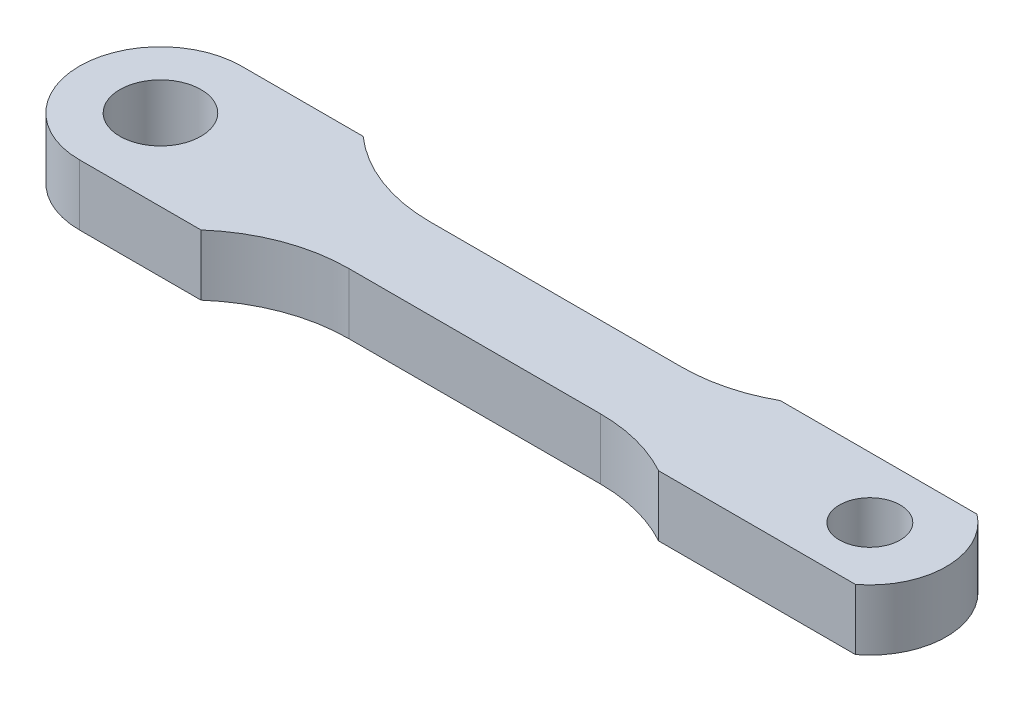
ISO-10303-21;
HEADER;
FILE_DESCRIPTION(('STEP AP214'),'2;1');
FILE_NAME('part.step','',(''),(''),'','','');
FILE_SCHEMA(('AUTOMOTIVE_DESIGN { 1 0 10303 214 1 1 1 1 }'));
ENDSEC;
DATA;
#1=APPLICATION_CONTEXT('core data for automotive mechanical design processes');
#2=APPLICATION_PROTOCOL_DEFINITION('international standard','automotive_design',2000,#1);
#3=PRODUCT_CONTEXT('',#1,'mechanical');
#4=PRODUCT('Part','Part','',(#3));
#5=PRODUCT_RELATED_PRODUCT_CATEGORY('part','',(#4));
#6=PRODUCT_DEFINITION_FORMATION('','',#4);
#7=PRODUCT_DEFINITION_CONTEXT('part definition',#1,'design');
#8=PRODUCT_DEFINITION('design','',#6,#7);
#9=PRODUCT_DEFINITION_SHAPE('','',#8);
#10=(LENGTH_UNIT() NAMED_UNIT(*) SI_UNIT(.MILLI.,.METRE.));
#11=(NAMED_UNIT(*) PLANE_ANGLE_UNIT() SI_UNIT($,.RADIAN.));
#12=(NAMED_UNIT(*) SI_UNIT($,.STERADIAN.) SOLID_ANGLE_UNIT());
#13=UNCERTAINTY_MEASURE_WITH_UNIT(LENGTH_MEASURE(1.E-05),#10,'distance_accuracy_value','');
#14=(GEOMETRIC_REPRESENTATION_CONTEXT(3) GLOBAL_UNCERTAINTY_ASSIGNED_CONTEXT((#13)) GLOBAL_UNIT_ASSIGNED_CONTEXT((#10,
#11,#12)) REPRESENTATION_CONTEXT('',''));
#15=CARTESIAN_POINT('',(0.,0.,0.));
#16=DIRECTION('',(0.,0.,1.));
#17=DIRECTION('',(1.,0.,0.));
#18=AXIS2_PLACEMENT_3D('',#15,#16,#17);
#19=CARTESIAN_POINT('',(17.5,1.5,0.));
#20=DIRECTION('',(0.,1.,0.));
#21=DIRECTION('',(0.,0.,1.));
#22=AXIS2_PLACEMENT_3D('',#19,#20,#21);
#23=PLANE('',#22);
#24=CARTESIAN_POINT('',(-17.5,1.5,0.));
#25=DIRECTION('',(0.,1.,0.));
#26=DIRECTION('',(0.,0.,1.));
#27=AXIS2_PLACEMENT_3D('',#24,#25,#26);
#28=CIRCLE('',#27,2.);
#29=CARTESIAN_POINT('',(-17.5,1.5,2.));
#30=VERTEX_POINT('',#29);
#31=EDGE_CURVE('E170',#30,#30,#28,.T.);
#32=ORIENTED_EDGE('',*,*,#31,.F.);
#33=EDGE_LOOP('',(#32));
#34=FACE_BOUND('',#33,.T.);
#35=CARTESIAN_POINT('',(17.5,1.5,0.));
#36=DIRECTION('',(0.,1.,0.));
#37=DIRECTION('',(0.,0.,1.));
#38=AXIS2_PLACEMENT_3D('',#35,#36,#37);
#39=CIRCLE('',#38,3.77381633770019);
#40=CARTESIAN_POINT('',(19.7894736842106,1.5,3.));
#41=VERTEX_POINT('',#40);
#42=CARTESIAN_POINT('',(19.7894736842106,1.5,-3.));
#43=VERTEX_POINT('',#42);
#44=EDGE_CURVE('E200',#41,#43,#39,.T.);
#45=ORIENTED_EDGE('',*,*,#44,.T.);
#46=DIRECTION('',(-1.,0.,0.));
#47=VECTOR('',#46,1.);
#48=CARTESIAN_POINT('',(10.0814807240782,1.5,-3.));
#49=LINE('',#48,#47);
#50=CARTESIAN_POINT('',(10.0814807240782,1.5,-3.));
#51=VERTEX_POINT('',#50);
#52=EDGE_CURVE('E112',#43,#51,#49,.T.);
#53=ORIENTED_EDGE('',*,*,#52,.T.);
#54=CARTESIAN_POINT('',(6.20849737787082,1.5,-10.));
#55=DIRECTION('',(0.,-1.,0.));
#56=DIRECTION('',(0.,0.,1.));
#57=AXIS2_PLACEMENT_3D('',#54,#55,#56);
#58=CIRCLE('',#57,8.);
#59=CARTESIAN_POINT('',(6.20849737787082,1.5,-2.));
#60=VERTEX_POINT('',#59);
#61=EDGE_CURVE('E237',#51,#60,#58,.T.);
#62=ORIENTED_EDGE('',*,*,#61,.T.);
#63=DIRECTION('',(-1.,0.,0.));
#64=VECTOR('',#63,1.);
#65=CARTESIAN_POINT('',(6.20849737787082,1.5,-2.));
#66=LINE('',#65,#64);
#67=CARTESIAN_POINT('',(-6.20849737787082,1.5,-2.));
#68=VERTEX_POINT('',#67);
#69=EDGE_CURVE('E257',#60,#68,#66,.T.);
#70=ORIENTED_EDGE('',*,*,#69,.T.);
#71=CARTESIAN_POINT('',(-6.20849737787082,1.5,-10.));
#72=DIRECTION('',(0.,-1.,0.));
#73=DIRECTION('',(0.,0.,-1.));
#74=AXIS2_PLACEMENT_3D('',#71,#72,#73);
#75=CIRCLE('',#74,8.);
#76=CARTESIAN_POINT('',(-11.5,1.5,-4.));
#77=VERTEX_POINT('',#76);
#78=EDGE_CURVE('E253',#68,#77,#75,.T.);
#79=ORIENTED_EDGE('',*,*,#78,.T.);
#80=DIRECTION('',(-1.,0.,0.));
#81=VECTOR('',#80,1.);
#82=CARTESIAN_POINT('',(-11.5,1.5,-4.));
#83=LINE('',#82,#81);
#84=CARTESIAN_POINT('',(-17.5,1.5,-4.));
#85=VERTEX_POINT('',#84);
#86=EDGE_CURVE('E256',#77,#85,#83,.T.);
#87=ORIENTED_EDGE('',*,*,#86,.T.);
#88=CARTESIAN_POINT('',(-17.5,1.5,0.));
#89=DIRECTION('',(0.,1.,0.));
#90=DIRECTION('',(0.,0.,-1.));
#91=AXIS2_PLACEMENT_3D('',#88,#89,#90);
#92=CIRCLE('',#91,4.);
#93=CARTESIAN_POINT('',(-17.5,1.5,4.00000000000001));
#94=VERTEX_POINT('',#93);
#95=EDGE_CURVE('E261',#85,#94,#92,.T.);
#96=ORIENTED_EDGE('',*,*,#95,.T.);
#97=DIRECTION('',(1.,0.,0.));
#98=VECTOR('',#97,1.);
#99=CARTESIAN_POINT('',(-11.5,1.5,4.00000000000001));
#100=LINE('',#99,#98);
#101=CARTESIAN_POINT('',(-11.5,1.5,4.00000000000001));
#102=VERTEX_POINT('',#101);
#103=EDGE_CURVE('E268',#94,#102,#100,.T.);
#104=ORIENTED_EDGE('',*,*,#103,.T.);
#105=CARTESIAN_POINT('',(-6.20849737787082,1.5,10.));
#106=DIRECTION('',(0.,-1.,0.));
#107=DIRECTION('',(0.,0.,1.));
#108=AXIS2_PLACEMENT_3D('',#105,#106,#107);
#109=CIRCLE('',#108,8.);
#110=CARTESIAN_POINT('',(-6.20849737787082,1.5,2.));
#111=VERTEX_POINT('',#110);
#112=EDGE_CURVE('E143',#102,#111,#109,.T.);
#113=ORIENTED_EDGE('',*,*,#112,.T.);
#114=DIRECTION('',(1.,0.,0.));
#115=VECTOR('',#114,1.);
#116=CARTESIAN_POINT('',(6.20849737787082,1.5,2.));
#117=LINE('',#116,#115);
#118=CARTESIAN_POINT('',(6.20849737787082,1.5,2.));
#119=VERTEX_POINT('',#118);
#120=EDGE_CURVE('E137',#111,#119,#117,.T.);
#121=ORIENTED_EDGE('',*,*,#120,.T.);
#122=CARTESIAN_POINT('',(6.20849737787082,1.5,10.));
#123=DIRECTION('',(0.,-1.,0.));
#124=DIRECTION('',(0.,0.,-1.));
#125=AXIS2_PLACEMENT_3D('',#122,#123,#124);
#126=CIRCLE('',#125,8.);
#127=CARTESIAN_POINT('',(10.0814807240782,1.5,3.));
#128=VERTEX_POINT('',#127);
#129=EDGE_CURVE('E141',#119,#128,#126,.T.);
#130=ORIENTED_EDGE('',*,*,#129,.T.);
#131=DIRECTION('',(1.,0.,0.));
#132=VECTOR('',#131,1.);
#133=CARTESIAN_POINT('',(10.0814807240782,1.5,3.));
#134=LINE('',#133,#132);
#135=EDGE_CURVE('E57',#128,#41,#134,.T.);
#136=ORIENTED_EDGE('',*,*,#135,.T.);
#137=EDGE_LOOP('',(#45,#53,#62,#70,#79,#87,#96,#104,#113,#121,#130,#136));
#138=FACE_BOUND('',#137,.T.);
#139=CARTESIAN_POINT('',(17.5,1.5,0.));
#140=DIRECTION('',(0.,1.,0.));
#141=DIRECTION('',(0.,0.,1.));
#142=AXIS2_PLACEMENT_3D('',#139,#140,#141);
#143=CIRCLE('',#142,1.5);
#144=CARTESIAN_POINT('',(17.5,1.5,1.5));
#145=VERTEX_POINT('',#144);
#146=EDGE_CURVE('E312',#145,#145,#143,.T.);
#147=ORIENTED_EDGE('',*,*,#146,.F.);
#148=EDGE_LOOP('',(#147));
#149=FACE_BOUND('',#148,.T.);
#150=ADVANCED_FACE('F39',(#34,#138,#149),#23,.T.);
#151=CARTESIAN_POINT('',(17.5,-1.5,0.));
#152=DIRECTION('',(0.,1.,0.));
#153=DIRECTION('',(0.,0.,1.));
#154=AXIS2_PLACEMENT_3D('',#151,#152,#153);
#155=PLANE('',#154);
#156=CARTESIAN_POINT('',(17.5,-1.5,0.));
#157=DIRECTION('',(0.,1.,0.));
#158=DIRECTION('',(0.,0.,1.));
#159=AXIS2_PLACEMENT_3D('',#156,#157,#158);
#160=CIRCLE('',#159,3.77381633770019);
#161=CARTESIAN_POINT('',(19.7894736842106,-1.5,3.));
#162=VERTEX_POINT('',#161);
#163=CARTESIAN_POINT('',(19.7894736842106,-1.5,-3.));
#164=VERTEX_POINT('',#163);
#165=EDGE_CURVE('E165',#162,#164,#160,.T.);
#166=ORIENTED_EDGE('',*,*,#165,.F.);
#167=DIRECTION('',(1.,0.,0.));
#168=VECTOR('',#167,1.);
#169=CARTESIAN_POINT('',(10.0814807240782,-1.5,3.));
#170=LINE('',#169,#168);
#171=CARTESIAN_POINT('',(10.0814807240782,-1.5,3.));
#172=VERTEX_POINT('',#171);
#173=EDGE_CURVE('E104',#172,#162,#170,.T.);
#174=ORIENTED_EDGE('',*,*,#173,.F.);
#175=CARTESIAN_POINT('',(6.20849737787082,-1.5,10.));
#176=DIRECTION('',(0.,-1.,0.));
#177=DIRECTION('',(0.,0.,-1.));
#178=AXIS2_PLACEMENT_3D('',#175,#176,#177);
#179=CIRCLE('',#178,8.);
#180=CARTESIAN_POINT('',(6.20849737787082,-1.5,2.));
#181=VERTEX_POINT('',#180);
#182=EDGE_CURVE('E98',#181,#172,#179,.T.);
#183=ORIENTED_EDGE('',*,*,#182,.F.);
#184=DIRECTION('',(1.,0.,0.));
#185=VECTOR('',#184,1.);
#186=CARTESIAN_POINT('',(6.20849737787082,-1.5,2.));
#187=LINE('',#186,#185);
#188=CARTESIAN_POINT('',(-6.20849737787082,-1.5,2.));
#189=VERTEX_POINT('',#188);
#190=EDGE_CURVE('E152',#189,#181,#187,.T.);
#191=ORIENTED_EDGE('',*,*,#190,.F.);
#192=CARTESIAN_POINT('',(-6.20849737787082,-1.5,10.));
#193=DIRECTION('',(0.,-1.,0.));
#194=DIRECTION('',(0.,0.,1.));
#195=AXIS2_PLACEMENT_3D('',#192,#193,#194);
#196=CIRCLE('',#195,8.);
#197=CARTESIAN_POINT('',(-11.5,-1.5,4.00000000000001));
#198=VERTEX_POINT('',#197);
#199=EDGE_CURVE('E191',#198,#189,#196,.T.);
#200=ORIENTED_EDGE('',*,*,#199,.F.);
#201=DIRECTION('',(1.,0.,0.));
#202=VECTOR('',#201,1.);
#203=CARTESIAN_POINT('',(-11.5,-1.5,4.00000000000001));
#204=LINE('',#203,#202);
#205=CARTESIAN_POINT('',(-17.5,-1.5,4.00000000000001));
#206=VERTEX_POINT('',#205);
#207=EDGE_CURVE('E188',#206,#198,#204,.T.);
#208=ORIENTED_EDGE('',*,*,#207,.F.);
#209=CARTESIAN_POINT('',(-17.5,-1.5,0.));
#210=DIRECTION('',(0.,1.,0.));
#211=DIRECTION('',(0.,0.,-1.));
#212=AXIS2_PLACEMENT_3D('',#209,#210,#211);
#213=CIRCLE('',#212,4.);
#214=CARTESIAN_POINT('',(-17.5,-1.5,-4.));
#215=VERTEX_POINT('',#214);
#216=EDGE_CURVE('E185',#215,#206,#213,.T.);
#217=ORIENTED_EDGE('',*,*,#216,.F.);
#218=DIRECTION('',(-1.,0.,0.));
#219=VECTOR('',#218,1.);
#220=CARTESIAN_POINT('',(-11.5,-1.5,-4.));
#221=LINE('',#220,#219);
#222=CARTESIAN_POINT('',(-11.5,-1.5,-4.));
#223=VERTEX_POINT('',#222);
#224=EDGE_CURVE('E182',#223,#215,#221,.T.);
#225=ORIENTED_EDGE('',*,*,#224,.F.);
#226=CARTESIAN_POINT('',(-6.20849737787082,-1.5,-10.));
#227=DIRECTION('',(0.,-1.,0.));
#228=DIRECTION('',(0.,0.,-1.));
#229=AXIS2_PLACEMENT_3D('',#226,#227,#228);
#230=CIRCLE('',#229,8.);
#231=CARTESIAN_POINT('',(-6.20849737787082,-1.5,-2.));
#232=VERTEX_POINT('',#231);
#233=EDGE_CURVE('E179',#232,#223,#230,.T.);
#234=ORIENTED_EDGE('',*,*,#233,.F.);
#235=DIRECTION('',(-1.,0.,0.));
#236=VECTOR('',#235,1.);
#237=CARTESIAN_POINT('',(6.20849737787082,-1.5,-2.));
#238=LINE('',#237,#236);
#239=CARTESIAN_POINT('',(6.20849737787082,-1.5,-2.));
#240=VERTEX_POINT('',#239);
#241=EDGE_CURVE('E176',#240,#232,#238,.T.);
#242=ORIENTED_EDGE('',*,*,#241,.F.);
#243=CARTESIAN_POINT('',(6.20849737787082,-1.5,-10.));
#244=DIRECTION('',(0.,-1.,0.));
#245=DIRECTION('',(0.,0.,1.));
#246=AXIS2_PLACEMENT_3D('',#243,#244,#245);
#247=CIRCLE('',#246,8.);
#248=CARTESIAN_POINT('',(10.0814807240782,-1.5,-3.));
#249=VERTEX_POINT('',#248);
#250=EDGE_CURVE('E173',#249,#240,#247,.T.);
#251=ORIENTED_EDGE('',*,*,#250,.F.);
#252=DIRECTION('',(-1.,0.,0.));
#253=VECTOR('',#252,1.);
#254=CARTESIAN_POINT('',(10.0814807240782,-1.5,-3.));
#255=LINE('',#254,#253);
#256=EDGE_CURVE('E169',#164,#249,#255,.T.);
#257=ORIENTED_EDGE('',*,*,#256,.F.);
#258=EDGE_LOOP('',(#166,#174,#183,#191,#200,#208,#217,#225,#234,#242,#251,#257));
#259=FACE_BOUND('',#258,.T.);
#260=CARTESIAN_POINT('',(-17.5,-1.5,0.));
#261=DIRECTION('',(0.,1.,0.));
#262=DIRECTION('',(0.,0.,1.));
#263=AXIS2_PLACEMENT_3D('',#260,#261,#262);
#264=CIRCLE('',#263,2.);
#265=CARTESIAN_POINT('',(-17.5,-1.5,2.));
#266=VERTEX_POINT('',#265);
#267=EDGE_CURVE('E320',#266,#266,#264,.T.);
#268=ORIENTED_EDGE('',*,*,#267,.T.);
#269=EDGE_LOOP('',(#268));
#270=FACE_BOUND('',#269,.T.);
#271=CARTESIAN_POINT('',(17.5,-1.5,0.));
#272=DIRECTION('',(0.,1.,0.));
#273=DIRECTION('',(0.,0.,1.));
#274=AXIS2_PLACEMENT_3D('',#271,#272,#273);
#275=CIRCLE('',#274,1.5);
#276=CARTESIAN_POINT('',(17.5,-1.5,1.5));
#277=VERTEX_POINT('',#276);
#278=EDGE_CURVE('E315',#277,#277,#275,.T.);
#279=ORIENTED_EDGE('',*,*,#278,.T.);
#280=EDGE_LOOP('',(#279));
#281=FACE_BOUND('',#280,.T.);
#282=ADVANCED_FACE('F241',(#259,#270,#281),#155,.F.);
#283=CARTESIAN_POINT('',(17.5,1.5,0.));
#284=DIRECTION('',(0.,-1.,0.));
#285=DIRECTION('',(0.,0.,-1.));
#286=AXIS2_PLACEMENT_3D('',#283,#284,#285);
#287=CYLINDRICAL_SURFACE('',#286,3.77381633770019);
#288=ORIENTED_EDGE('',*,*,#165,.T.);
#289=DIRECTION('',(0.,-1.,0.));
#290=VECTOR('',#289,1.);
#291=CARTESIAN_POINT('',(19.7894736842106,1.5,-3.));
#292=LINE('',#291,#290);
#293=EDGE_CURVE('E11',#43,#164,#292,.T.);
#294=ORIENTED_EDGE('',*,*,#293,.F.);
#295=ORIENTED_EDGE('',*,*,#44,.F.);
#296=DIRECTION('',(0.,-1.,0.));
#297=VECTOR('',#296,1.);
#298=CARTESIAN_POINT('',(19.7894736842106,1.5,3.));
#299=LINE('',#298,#297);
#300=EDGE_CURVE('E161',#41,#162,#299,.T.);
#301=ORIENTED_EDGE('',*,*,#300,.T.);
#302=EDGE_LOOP('',(#288,#294,#295,#301));
#303=FACE_BOUND('',#302,.T.);
#304=ADVANCED_FACE('F41',(#303),#287,.T.);
#305=CARTESIAN_POINT('',(10.0814807240782,1.5,-3.));
#306=DIRECTION('',(0.,0.,1.));
#307=DIRECTION('',(1.,0.,0.));
#308=AXIS2_PLACEMENT_3D('',#305,#306,#307);
#309=PLANE('',#308);
#310=ORIENTED_EDGE('',*,*,#256,.T.);
#311=DIRECTION('',(0.,-1.,0.));
#312=VECTOR('',#311,1.);
#313=CARTESIAN_POINT('',(10.0814807240782,1.5,-3.));
#314=LINE('',#313,#312);
#315=EDGE_CURVE('E49',#51,#249,#314,.T.);
#316=ORIENTED_EDGE('',*,*,#315,.F.);
#317=ORIENTED_EDGE('',*,*,#52,.F.);
#318=ORIENTED_EDGE('',*,*,#293,.T.);
#319=EDGE_LOOP('',(#310,#316,#317,#318));
#320=FACE_BOUND('',#319,.T.);
#321=ADVANCED_FACE('F418',(#320),#309,.F.);
#322=CARTESIAN_POINT('',(6.20849737787082,1.5,-10.));
#323=DIRECTION('',(0.,-1.,0.));
#324=DIRECTION('',(0.,0.,-1.));
#325=AXIS2_PLACEMENT_3D('',#322,#323,#324);
#326=CYLINDRICAL_SURFACE('',#325,8.);
#327=ORIENTED_EDGE('',*,*,#250,.T.);
#328=DIRECTION('',(0.,-1.,0.));
#329=VECTOR('',#328,1.);
#330=CARTESIAN_POINT('',(6.20849737787082,1.5,-2.));
#331=LINE('',#330,#329);
#332=EDGE_CURVE('E227',#60,#240,#331,.T.);
#333=ORIENTED_EDGE('',*,*,#332,.F.);
#334=ORIENTED_EDGE('',*,*,#61,.F.);
#335=ORIENTED_EDGE('',*,*,#315,.T.);
#336=EDGE_LOOP('',(#327,#333,#334,#335));
#337=FACE_BOUND('',#336,.T.);
#338=ADVANCED_FACE('F235',(#337),#326,.F.);
#339=CARTESIAN_POINT('',(6.20849737787082,1.5,-2.));
#340=DIRECTION('',(0.,0.,1.));
#341=DIRECTION('',(1.,0.,0.));
#342=AXIS2_PLACEMENT_3D('',#339,#340,#341);
#343=PLANE('',#342);
#344=ORIENTED_EDGE('',*,*,#241,.T.);
#345=DIRECTION('',(0.,-1.,0.));
#346=VECTOR('',#345,1.);
#347=CARTESIAN_POINT('',(-6.20849737787082,1.5,-2.));
#348=LINE('',#347,#346);
#349=EDGE_CURVE('E223',#68,#232,#348,.T.);
#350=ORIENTED_EDGE('',*,*,#349,.F.);
#351=ORIENTED_EDGE('',*,*,#69,.F.);
#352=ORIENTED_EDGE('',*,*,#332,.T.);
#353=EDGE_LOOP('',(#344,#350,#351,#352));
#354=FACE_BOUND('',#353,.T.);
#355=ADVANCED_FACE('F247',(#354),#343,.F.);
#356=CARTESIAN_POINT('',(-6.20849737787082,1.5,-10.));
#357=DIRECTION('',(0.,-1.,0.));
#358=DIRECTION('',(0.,0.,-1.));
#359=AXIS2_PLACEMENT_3D('',#356,#357,#358);
#360=CYLINDRICAL_SURFACE('',#359,8.);
#361=ORIENTED_EDGE('',*,*,#233,.T.);
#362=DIRECTION('',(0.,-1.,0.));
#363=VECTOR('',#362,1.);
#364=CARTESIAN_POINT('',(-11.5,1.5,-4.));
#365=LINE('',#364,#363);
#366=EDGE_CURVE('E219',#77,#223,#365,.T.);
#367=ORIENTED_EDGE('',*,*,#366,.F.);
#368=ORIENTED_EDGE('',*,*,#78,.F.);
#369=ORIENTED_EDGE('',*,*,#349,.T.);
#370=EDGE_LOOP('',(#361,#367,#368,#369));
#371=FACE_BOUND('',#370,.T.);
#372=ADVANCED_FACE('F251',(#371),#360,.F.);
#373=CARTESIAN_POINT('',(-11.5,1.5,-4.));
#374=DIRECTION('',(0.,0.,1.));
#375=DIRECTION('',(1.,0.,0.));
#376=AXIS2_PLACEMENT_3D('',#373,#374,#375);
#377=PLANE('',#376);
#378=ORIENTED_EDGE('',*,*,#224,.T.);
#379=DIRECTION('',(0.,-1.,0.));
#380=VECTOR('',#379,1.);
#381=CARTESIAN_POINT('',(-17.5,1.5,-4.));
#382=LINE('',#381,#380);
#383=EDGE_CURVE('E215',#85,#215,#382,.T.);
#384=ORIENTED_EDGE('',*,*,#383,.F.);
#385=ORIENTED_EDGE('',*,*,#86,.F.);
#386=ORIENTED_EDGE('',*,*,#366,.T.);
#387=EDGE_LOOP('',(#378,#384,#385,#386));
#388=FACE_BOUND('',#387,.T.);
#389=ADVANCED_FACE('F383',(#388),#377,.F.);
#390=CARTESIAN_POINT('',(-17.5,1.5,0.));
#391=DIRECTION('',(0.,-1.,0.));
#392=DIRECTION('',(0.,0.,-1.));
#393=AXIS2_PLACEMENT_3D('',#390,#391,#392);
#394=CYLINDRICAL_SURFACE('',#393,4.);
#395=ORIENTED_EDGE('',*,*,#216,.T.);
#396=DIRECTION('',(0.,-1.,0.));
#397=VECTOR('',#396,1.);
#398=CARTESIAN_POINT('',(-17.5,1.5,4.00000000000001));
#399=LINE('',#398,#397);
#400=EDGE_CURVE('E211',#94,#206,#399,.T.);
#401=ORIENTED_EDGE('',*,*,#400,.F.);
#402=ORIENTED_EDGE('',*,*,#95,.F.);
#403=ORIENTED_EDGE('',*,*,#383,.T.);
#404=EDGE_LOOP('',(#395,#401,#402,#403));
#405=FACE_BOUND('',#404,.T.);
#406=ADVANCED_FACE('F374',(#405),#394,.T.);
#407=CARTESIAN_POINT('',(-11.5,1.5,4.00000000000001));
#408=DIRECTION('',(0.,0.,-1.));
#409=DIRECTION('',(-1.,0.,0.));
#410=AXIS2_PLACEMENT_3D('',#407,#408,#409);
#411=PLANE('',#410);
#412=ORIENTED_EDGE('',*,*,#207,.T.);
#413=DIRECTION('',(0.,-1.,0.));
#414=VECTOR('',#413,1.);
#415=CARTESIAN_POINT('',(-11.5,1.5,4.00000000000001));
#416=LINE('',#415,#414);
#417=EDGE_CURVE('E207',#102,#198,#416,.T.);
#418=ORIENTED_EDGE('',*,*,#417,.F.);
#419=ORIENTED_EDGE('',*,*,#103,.F.);
#420=ORIENTED_EDGE('',*,*,#400,.T.);
#421=EDGE_LOOP('',(#412,#418,#419,#420));
#422=FACE_BOUND('',#421,.T.);
#423=ADVANCED_FACE('F276',(#422),#411,.F.);
#424=CARTESIAN_POINT('',(-6.20849737787082,1.5,10.));
#425=DIRECTION('',(0.,-1.,0.));
#426=DIRECTION('',(0.,0.,-1.));
#427=AXIS2_PLACEMENT_3D('',#424,#425,#426);
#428=CYLINDRICAL_SURFACE('',#427,8.);
#429=ORIENTED_EDGE('',*,*,#199,.T.);
#430=DIRECTION('',(0.,-1.,0.));
#431=VECTOR('',#430,1.);
#432=CARTESIAN_POINT('',(-6.20849737787082,1.5,2.));
#433=LINE('',#432,#431);
#434=EDGE_CURVE('E154',#111,#189,#433,.T.);
#435=ORIENTED_EDGE('',*,*,#434,.F.);
#436=ORIENTED_EDGE('',*,*,#112,.F.);
#437=ORIENTED_EDGE('',*,*,#417,.T.);
#438=EDGE_LOOP('',(#429,#435,#436,#437));
#439=FACE_BOUND('',#438,.T.);
#440=ADVANCED_FACE('F280',(#439),#428,.F.);
#441=CARTESIAN_POINT('',(6.20849737787082,1.5,2.));
#442=DIRECTION('',(0.,0.,-1.));
#443=DIRECTION('',(-1.,0.,0.));
#444=AXIS2_PLACEMENT_3D('',#441,#442,#443);
#445=PLANE('',#444);
#446=ORIENTED_EDGE('',*,*,#190,.T.);
#447=DIRECTION('',(0.,-1.,0.));
#448=VECTOR('',#447,1.);
#449=CARTESIAN_POINT('',(6.20849737787082,1.5,2.));
#450=LINE('',#449,#448);
#451=EDGE_CURVE('E149',#119,#181,#450,.T.);
#452=ORIENTED_EDGE('',*,*,#451,.F.);
#453=ORIENTED_EDGE('',*,*,#120,.F.);
#454=ORIENTED_EDGE('',*,*,#434,.T.);
#455=EDGE_LOOP('',(#446,#452,#453,#454));
#456=FACE_BOUND('',#455,.T.);
#457=ADVANCED_FACE('F150',(#456),#445,.F.);
#458=CARTESIAN_POINT('',(6.20849737787082,1.5,10.));
#459=DIRECTION('',(0.,-1.,0.));
#460=DIRECTION('',(0.,0.,-1.));
#461=AXIS2_PLACEMENT_3D('',#458,#459,#460);
#462=CYLINDRICAL_SURFACE('',#461,8.);
#463=ORIENTED_EDGE('',*,*,#182,.T.);
#464=DIRECTION('',(0.,-1.,0.));
#465=VECTOR('',#464,1.);
#466=CARTESIAN_POINT('',(10.0814807240782,1.5,3.));
#467=LINE('',#466,#465);
#468=EDGE_CURVE('E155',#128,#172,#467,.T.);
#469=ORIENTED_EDGE('',*,*,#468,.F.);
#470=ORIENTED_EDGE('',*,*,#129,.F.);
#471=ORIENTED_EDGE('',*,*,#451,.T.);
#472=EDGE_LOOP('',(#463,#469,#470,#471));
#473=FACE_BOUND('',#472,.T.);
#474=ADVANCED_FACE('F157',(#473),#462,.F.);
#475=CARTESIAN_POINT('',(10.0814807240782,1.5,3.));
#476=DIRECTION('',(0.,0.,-1.));
#477=DIRECTION('',(-1.,0.,0.));
#478=AXIS2_PLACEMENT_3D('',#475,#476,#477);
#479=PLANE('',#478);
#480=ORIENTED_EDGE('',*,*,#173,.T.);
#481=ORIENTED_EDGE('',*,*,#300,.F.);
#482=ORIENTED_EDGE('',*,*,#135,.F.);
#483=ORIENTED_EDGE('',*,*,#468,.T.);
#484=EDGE_LOOP('',(#480,#481,#482,#483));
#485=FACE_BOUND('',#484,.T.);
#486=ADVANCED_FACE('F284',(#485),#479,.F.);
#487=CARTESIAN_POINT('',(-17.5,1.5,0.));
#488=DIRECTION('',(0.,-1.,0.));
#489=DIRECTION('',(0.,0.,-1.));
#490=AXIS2_PLACEMENT_3D('',#487,#488,#489);
#491=CYLINDRICAL_SURFACE('',#490,2.);
#492=ORIENTED_EDGE('',*,*,#31,.T.);
#493=EDGE_LOOP('',(#492));
#494=FACE_BOUND('',#493,.T.);
#495=ORIENTED_EDGE('',*,*,#267,.F.);
#496=EDGE_LOOP('',(#495));
#497=FACE_BOUND('',#496,.T.);
#498=ADVANCED_FACE('F286',(#494,#497),#491,.F.);
#499=CARTESIAN_POINT('',(17.5,1.5,0.));
#500=DIRECTION('',(0.,-1.,0.));
#501=DIRECTION('',(0.,0.,-1.));
#502=AXIS2_PLACEMENT_3D('',#499,#500,#501);
#503=CYLINDRICAL_SURFACE('',#502,1.5);
#504=ORIENTED_EDGE('',*,*,#146,.T.);
#505=EDGE_LOOP('',(#504));
#506=FACE_BOUND('',#505,.T.);
#507=ORIENTED_EDGE('',*,*,#278,.F.);
#508=EDGE_LOOP('',(#507));
#509=FACE_BOUND('',#508,.T.);
#510=ADVANCED_FACE('F292',(#506,#509),#503,.F.);
#511=CLOSED_SHELL('',(#150,#282,#304,#321,#338,#355,#372,#389,#406,#423,#440,#457,#474,#486,
#498,#510));
#512=MANIFOLD_SOLID_BREP('B2',#511);
#513=ADVANCED_BREP_SHAPE_REPRESENTATION('',(#18,#512),#14);
#514=SHAPE_DEFINITION_REPRESENTATION(#9,#513);
ENDSEC;
END-ISO-10303-21;
